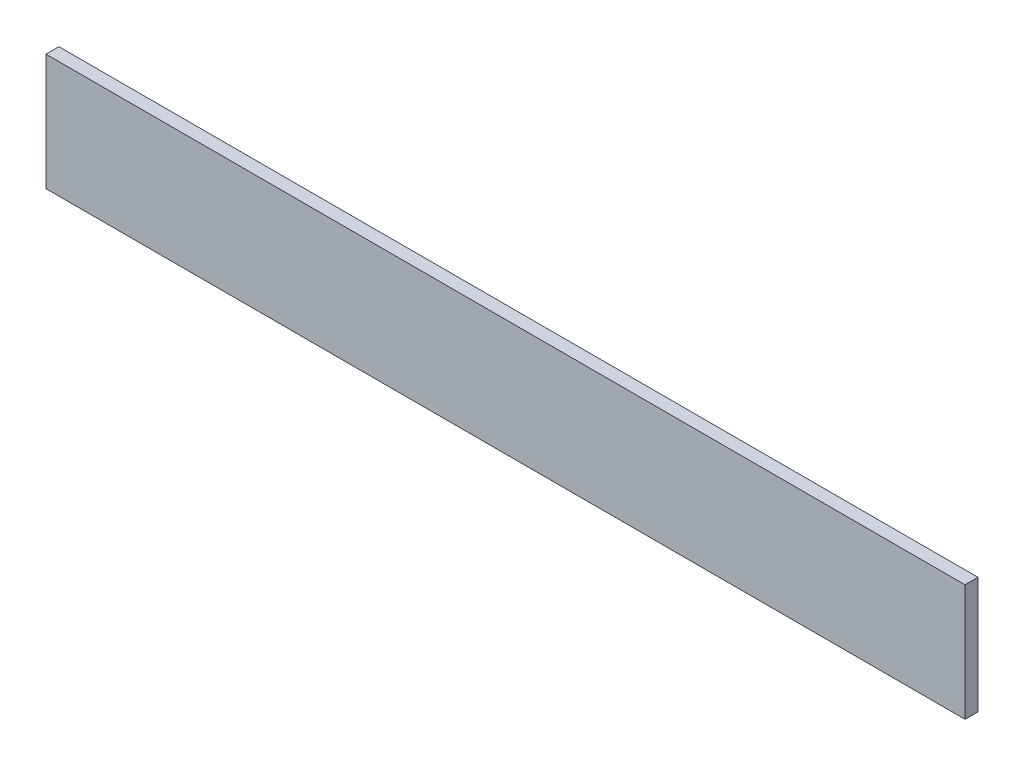
ISO-10303-21;
HEADER;
FILE_DESCRIPTION(('STEP AP214'),'2;1');
FILE_NAME('part.step','',(''),(''),'','','');
FILE_SCHEMA(('AUTOMOTIVE_DESIGN { 1 0 10303 214 1 1 1 1 }'));
ENDSEC;
DATA;
#1=APPLICATION_CONTEXT('core data for automotive mechanical design processes');
#2=APPLICATION_PROTOCOL_DEFINITION('international standard','automotive_design',2000,#1);
#3=PRODUCT_CONTEXT('',#1,'mechanical');
#4=PRODUCT('Part','Part','',(#3));
#5=PRODUCT_RELATED_PRODUCT_CATEGORY('part','',(#4));
#6=PRODUCT_DEFINITION_FORMATION('','',#4);
#7=PRODUCT_DEFINITION_CONTEXT('part definition',#1,'design');
#8=PRODUCT_DEFINITION('design','',#6,#7);
#9=PRODUCT_DEFINITION_SHAPE('','',#8);
#10=(LENGTH_UNIT() NAMED_UNIT(*) SI_UNIT(.MILLI.,.METRE.));
#11=(NAMED_UNIT(*) PLANE_ANGLE_UNIT() SI_UNIT($,.RADIAN.));
#12=(NAMED_UNIT(*) SI_UNIT($,.STERADIAN.) SOLID_ANGLE_UNIT());
#13=UNCERTAINTY_MEASURE_WITH_UNIT(LENGTH_MEASURE(1.E-05),#10,'distance_accuracy_value','');
#14=(GEOMETRIC_REPRESENTATION_CONTEXT(3) GLOBAL_UNCERTAINTY_ASSIGNED_CONTEXT((#13)) GLOBAL_UNIT_ASSIGNED_CONTEXT((#10,
#11,#12)) REPRESENTATION_CONTEXT('',''));
#15=CARTESIAN_POINT('',(0.,0.,0.));
#16=DIRECTION('',(0.,0.,1.));
#17=DIRECTION('',(1.,0.,0.));
#18=AXIS2_PLACEMENT_3D('',#15,#16,#17);
#19=CARTESIAN_POINT('',(0.,0.,12.7));
#20=DIRECTION('',(1.,0.,0.));
#21=DIRECTION('',(0.,0.,-1.));
#22=AXIS2_PLACEMENT_3D('',#19,#20,#21);
#23=PLANE('',#22);
#24=DIRECTION('',(0.,-1.,0.));
#25=VECTOR('',#24,1.);
#26=CARTESIAN_POINT('',(0.,0.,0.));
#27=LINE('',#26,#25);
#28=CARTESIAN_POINT('',(0.,114.3,0.));
#29=VERTEX_POINT('',#28);
#30=CARTESIAN_POINT('',(0.,0.,0.));
#31=VERTEX_POINT('',#30);
#32=EDGE_CURVE('E98',#29,#31,#27,.T.);
#33=ORIENTED_EDGE('',*,*,#32,.T.);
#34=DIRECTION('',(0.,0.,-1.));
#35=VECTOR('',#34,1.);
#36=CARTESIAN_POINT('',(0.,0.,12.7));
#37=LINE('',#36,#35);
#38=CARTESIAN_POINT('',(0.,0.,12.7));
#39=VERTEX_POINT('',#38);
#40=EDGE_CURVE('E11',#39,#31,#37,.T.);
#41=ORIENTED_EDGE('',*,*,#40,.F.);
#42=DIRECTION('',(0.,-1.,0.));
#43=VECTOR('',#42,1.);
#44=CARTESIAN_POINT('',(0.,0.,12.7));
#45=LINE('',#44,#43);
#46=CARTESIAN_POINT('',(0.,114.3,12.7));
#47=VERTEX_POINT('',#46);
#48=EDGE_CURVE('E86',#47,#39,#45,.T.);
#49=ORIENTED_EDGE('',*,*,#48,.F.);
#50=DIRECTION('',(0.,0.,-1.));
#51=VECTOR('',#50,1.);
#52=CARTESIAN_POINT('',(0.,114.3,12.7));
#53=LINE('',#52,#51);
#54=EDGE_CURVE('E94',#47,#29,#53,.T.);
#55=ORIENTED_EDGE('',*,*,#54,.T.);
#56=EDGE_LOOP('',(#33,#41,#49,#55));
#57=FACE_BOUND('',#56,.T.);
#58=ADVANCED_FACE('F35',(#57),#23,.F.);
#59=CARTESIAN_POINT('',(0.,0.,12.7));
#60=DIRECTION('',(0.,1.,0.));
#61=DIRECTION('',(0.,0.,1.));
#62=AXIS2_PLACEMENT_3D('',#59,#60,#61);
#63=PLANE('',#62);
#64=DIRECTION('',(1.,0.,0.));
#65=VECTOR('',#64,1.);
#66=CARTESIAN_POINT('',(0.,0.,0.));
#67=LINE('',#66,#65);
#68=CARTESIAN_POINT('',(901.7,0.,0.));
#69=VERTEX_POINT('',#68);
#70=EDGE_CURVE('E90',#31,#69,#67,.T.);
#71=ORIENTED_EDGE('',*,*,#70,.T.);
#72=DIRECTION('',(0.,0.,-1.));
#73=VECTOR('',#72,1.);
#74=CARTESIAN_POINT('',(901.7,0.,12.7));
#75=LINE('',#74,#73);
#76=CARTESIAN_POINT('',(901.7,0.,12.7));
#77=VERTEX_POINT('',#76);
#78=EDGE_CURVE('E43',#77,#69,#75,.T.);
#79=ORIENTED_EDGE('',*,*,#78,.F.);
#80=DIRECTION('',(1.,0.,0.));
#81=VECTOR('',#80,1.);
#82=CARTESIAN_POINT('',(0.,0.,12.7));
#83=LINE('',#82,#81);
#84=EDGE_CURVE('E81',#39,#77,#83,.T.);
#85=ORIENTED_EDGE('',*,*,#84,.F.);
#86=ORIENTED_EDGE('',*,*,#40,.T.);
#87=EDGE_LOOP('',(#71,#79,#85,#86));
#88=FACE_BOUND('',#87,.T.);
#89=ADVANCED_FACE('F89',(#88),#63,.F.);
#90=CARTESIAN_POINT('',(901.7,0.,12.7));
#91=DIRECTION('',(-1.,0.,0.));
#92=DIRECTION('',(0.,0.,1.));
#93=AXIS2_PLACEMENT_3D('',#90,#91,#92);
#94=PLANE('',#93);
#95=DIRECTION('',(0.,1.,0.));
#96=VECTOR('',#95,1.);
#97=CARTESIAN_POINT('',(901.7,0.,0.));
#98=LINE('',#97,#96);
#99=CARTESIAN_POINT('',(901.7,114.3,0.));
#100=VERTEX_POINT('',#99);
#101=EDGE_CURVE('E68',#69,#100,#98,.T.);
#102=ORIENTED_EDGE('',*,*,#101,.T.);
#103=DIRECTION('',(0.,0.,-1.));
#104=VECTOR('',#103,1.);
#105=CARTESIAN_POINT('',(901.7,114.3,12.7));
#106=LINE('',#105,#104);
#107=CARTESIAN_POINT('',(901.7,114.3,12.7));
#108=VERTEX_POINT('',#107);
#109=EDGE_CURVE('E91',#108,#100,#106,.T.);
#110=ORIENTED_EDGE('',*,*,#109,.F.);
#111=DIRECTION('',(0.,1.,0.));
#112=VECTOR('',#111,1.);
#113=CARTESIAN_POINT('',(901.7,0.,12.7));
#114=LINE('',#113,#112);
#115=EDGE_CURVE('E84',#77,#108,#114,.T.);
#116=ORIENTED_EDGE('',*,*,#115,.F.);
#117=ORIENTED_EDGE('',*,*,#78,.T.);
#118=EDGE_LOOP('',(#102,#110,#116,#117));
#119=FACE_BOUND('',#118,.T.);
#120=ADVANCED_FACE('F92',(#119),#94,.F.);
#121=CARTESIAN_POINT('',(0.,114.3,12.7));
#122=DIRECTION('',(0.,-1.,0.));
#123=DIRECTION('',(0.,0.,-1.));
#124=AXIS2_PLACEMENT_3D('',#121,#122,#123);
#125=PLANE('',#124);
#126=DIRECTION('',(-1.,0.,0.));
#127=VECTOR('',#126,1.);
#128=CARTESIAN_POINT('',(0.,114.3,0.));
#129=LINE('',#128,#127);
#130=EDGE_CURVE('E74',#100,#29,#129,.T.);
#131=ORIENTED_EDGE('',*,*,#130,.T.);
#132=ORIENTED_EDGE('',*,*,#54,.F.);
#133=DIRECTION('',(-1.,0.,0.));
#134=VECTOR('',#133,1.);
#135=CARTESIAN_POINT('',(0.,114.3,12.7));
#136=LINE('',#135,#134);
#137=EDGE_CURVE('E51',#108,#47,#136,.T.);
#138=ORIENTED_EDGE('',*,*,#137,.F.);
#139=ORIENTED_EDGE('',*,*,#109,.T.);
#140=EDGE_LOOP('',(#131,#132,#138,#139));
#141=FACE_BOUND('',#140,.T.);
#142=ADVANCED_FACE('F105',(#141),#125,.F.);
#143=CARTESIAN_POINT('',(0.,0.,12.7));
#144=DIRECTION('',(0.,0.,-1.));
#145=DIRECTION('',(-1.,0.,0.));
#146=AXIS2_PLACEMENT_3D('',#143,#144,#145);
#147=PLANE('',#146);
#148=ORIENTED_EDGE('',*,*,#48,.T.);
#149=ORIENTED_EDGE('',*,*,#84,.T.);
#150=ORIENTED_EDGE('',*,*,#115,.T.);
#151=ORIENTED_EDGE('',*,*,#137,.T.);
#152=EDGE_LOOP('',(#148,#149,#150,#151));
#153=FACE_BOUND('',#152,.T.);
#154=ADVANCED_FACE('F82',(#153),#147,.F.);
#155=CARTESIAN_POINT('',(0.,0.,0.));
#156=DIRECTION('',(0.,0.,-1.));
#157=DIRECTION('',(-1.,0.,0.));
#158=AXIS2_PLACEMENT_3D('',#155,#156,#157);
#159=PLANE('',#158);
#160=ORIENTED_EDGE('',*,*,#32,.F.);
#161=ORIENTED_EDGE('',*,*,#130,.F.);
#162=ORIENTED_EDGE('',*,*,#101,.F.);
#163=ORIENTED_EDGE('',*,*,#70,.F.);
#164=EDGE_LOOP('',(#160,#161,#162,#163));
#165=FACE_BOUND('',#164,.T.);
#166=ADVANCED_FACE('F108',(#165),#159,.T.);
#167=CLOSED_SHELL('',(#58,#89,#120,#142,#154,#166));
#168=MANIFOLD_SOLID_BREP('B2',#167);
#169=ADVANCED_BREP_SHAPE_REPRESENTATION('',(#18,#168),#14);
#170=SHAPE_DEFINITION_REPRESENTATION(#9,#169);
ENDSEC;
END-ISO-10303-21;
